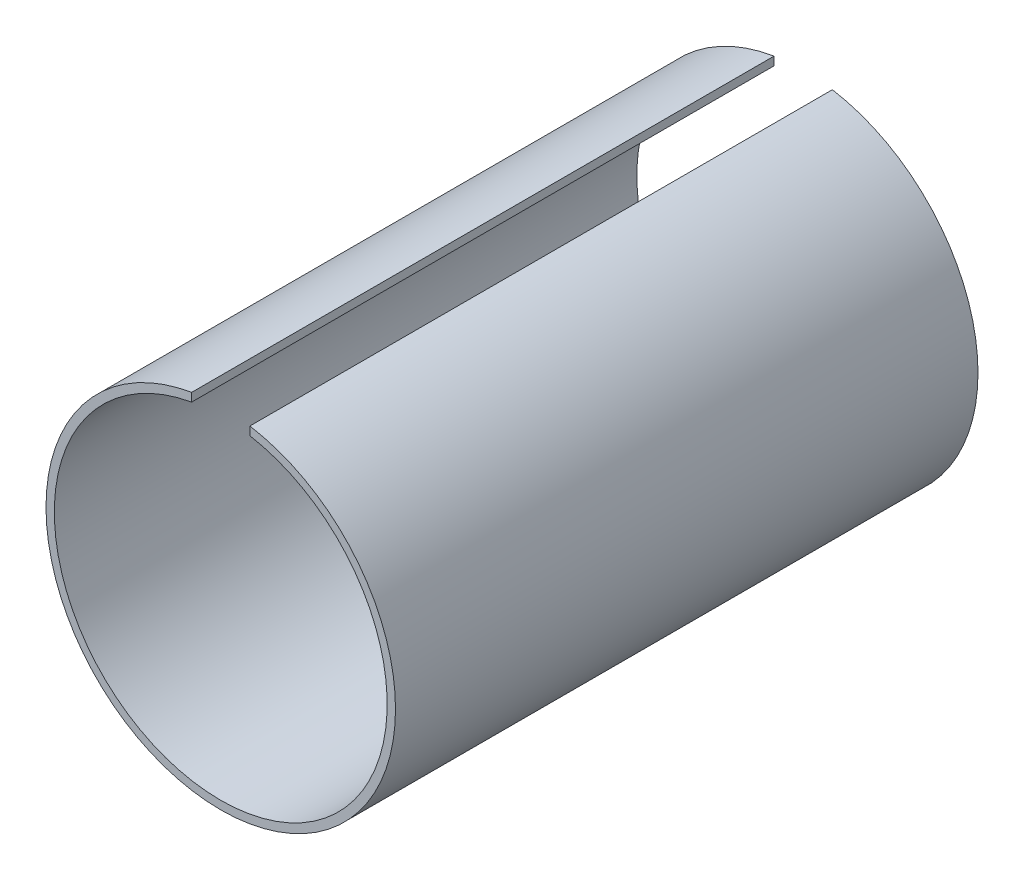
ISO-10303-21;
HEADER;
FILE_DESCRIPTION(('STEP AP214'),'2;1');
FILE_NAME('part.step','',(''),(''),'','','');
FILE_SCHEMA(('AUTOMOTIVE_DESIGN { 1 0 10303 214 1 1 1 1 }'));
ENDSEC;
DATA;
#1=APPLICATION_CONTEXT('core data for automotive mechanical design processes');
#2=APPLICATION_PROTOCOL_DEFINITION('international standard','automotive_design',2000,#1);
#3=PRODUCT_CONTEXT('',#1,'mechanical');
#4=PRODUCT('Part','Part','',(#3));
#5=PRODUCT_RELATED_PRODUCT_CATEGORY('part','',(#4));
#6=PRODUCT_DEFINITION_FORMATION('','',#4);
#7=PRODUCT_DEFINITION_CONTEXT('part definition',#1,'design');
#8=PRODUCT_DEFINITION('design','',#6,#7);
#9=PRODUCT_DEFINITION_SHAPE('','',#8);
#10=(LENGTH_UNIT() NAMED_UNIT(*) SI_UNIT(.MILLI.,.METRE.));
#11=(NAMED_UNIT(*) PLANE_ANGLE_UNIT() SI_UNIT($,.RADIAN.));
#12=(NAMED_UNIT(*) SI_UNIT($,.STERADIAN.) SOLID_ANGLE_UNIT());
#13=UNCERTAINTY_MEASURE_WITH_UNIT(LENGTH_MEASURE(1.E-05),#10,'distance_accuracy_value','');
#14=(GEOMETRIC_REPRESENTATION_CONTEXT(3) GLOBAL_UNCERTAINTY_ASSIGNED_CONTEXT((#13)) GLOBAL_UNIT_ASSIGNED_CONTEXT((#10,
#11,#12)) REPRESENTATION_CONTEXT('',''));
#15=CARTESIAN_POINT('',(0.,0.,0.));
#16=DIRECTION('',(0.,0.,1.));
#17=DIRECTION('',(1.,0.,0.));
#18=AXIS2_PLACEMENT_3D('',#15,#16,#17);
#19=CARTESIAN_POINT('',(0.,0.,35.));
#20=DIRECTION('',(0.,0.,1.));
#21=DIRECTION('',(1.,0.,0.));
#22=AXIS2_PLACEMENT_3D('',#19,#20,#21);
#23=PLANE('',#22);
#24=DIRECTION('',(0.,1.,0.));
#25=VECTOR('',#24,1.);
#26=CARTESIAN_POINT('',(3.5,0.,35.));
#27=LINE('',#26,#25);
#28=CARTESIAN_POINT('',(3.5,19.6913686675152,35.));
#29=VERTEX_POINT('',#28);
#30=CARTESIAN_POINT('',(3.5,20.7062792408487,35.));
#31=VERTEX_POINT('',#30);
#32=EDGE_CURVE('E108',#29,#31,#27,.T.);
#33=ORIENTED_EDGE('',*,*,#32,.F.);
#34=CARTESIAN_POINT('',(0.,0.,35.));
#35=DIRECTION('',(0.,0.,1.));
#36=DIRECTION('',(1.,0.,0.));
#37=AXIS2_PLACEMENT_3D('',#34,#35,#36);
#38=CIRCLE('',#37,20.);
#39=CARTESIAN_POINT('',(-3.5,19.6913686675152,35.));
#40=VERTEX_POINT('',#39);
#41=EDGE_CURVE('E117',#40,#29,#38,.T.);
#42=ORIENTED_EDGE('',*,*,#41,.F.);
#43=DIRECTION('',(0.,1.,0.));
#44=VECTOR('',#43,1.);
#45=CARTESIAN_POINT('',(-3.5,0.,35.));
#46=LINE('',#45,#44);
#47=CARTESIAN_POINT('',(-3.5,20.7062792408487,35.));
#48=VERTEX_POINT('',#47);
#49=EDGE_CURVE('E88',#40,#48,#46,.T.);
#50=ORIENTED_EDGE('',*,*,#49,.T.);
#51=CARTESIAN_POINT('',(0.,0.,35.));
#52=DIRECTION('',(0.,0.,1.));
#53=DIRECTION('',(1.,0.,0.));
#54=AXIS2_PLACEMENT_3D('',#51,#52,#53);
#55=CIRCLE('',#54,21.);
#56=EDGE_CURVE('E119',#48,#31,#55,.T.);
#57=ORIENTED_EDGE('',*,*,#56,.T.);
#58=EDGE_LOOP('',(#33,#42,#50,#57));
#59=FACE_BOUND('',#58,.T.);
#60=ADVANCED_FACE('F60',(#59),#23,.T.);
#61=CARTESIAN_POINT('',(0.,0.,-35.));
#62=DIRECTION('',(0.,0.,1.));
#63=DIRECTION('',(1.,0.,0.));
#64=AXIS2_PLACEMENT_3D('',#61,#62,#63);
#65=PLANE('',#64);
#66=CARTESIAN_POINT('',(0.,0.,-35.));
#67=DIRECTION('',(0.,0.,1.));
#68=DIRECTION('',(1.,0.,0.));
#69=AXIS2_PLACEMENT_3D('',#66,#67,#68);
#70=CIRCLE('',#69,20.);
#71=CARTESIAN_POINT('',(-3.5,19.6913686675152,-35.));
#72=VERTEX_POINT('',#71);
#73=CARTESIAN_POINT('',(3.5,19.6913686675152,-35.));
#74=VERTEX_POINT('',#73);
#75=EDGE_CURVE('E125',#72,#74,#70,.T.);
#76=ORIENTED_EDGE('',*,*,#75,.T.);
#77=DIRECTION('',(0.,1.,0.));
#78=VECTOR('',#77,1.);
#79=CARTESIAN_POINT('',(3.5,0.,-35.));
#80=LINE('',#79,#78);
#81=CARTESIAN_POINT('',(3.5,20.7062792408487,-35.));
#82=VERTEX_POINT('',#81);
#83=EDGE_CURVE('E78',#74,#82,#80,.T.);
#84=ORIENTED_EDGE('',*,*,#83,.T.);
#85=CARTESIAN_POINT('',(0.,0.,-35.));
#86=DIRECTION('',(0.,0.,1.));
#87=DIRECTION('',(1.,0.,0.));
#88=AXIS2_PLACEMENT_3D('',#85,#86,#87);
#89=CIRCLE('',#88,21.);
#90=CARTESIAN_POINT('',(-3.5,20.7062792408487,-35.));
#91=VERTEX_POINT('',#90);
#92=EDGE_CURVE('E124',#91,#82,#89,.T.);
#93=ORIENTED_EDGE('',*,*,#92,.F.);
#94=DIRECTION('',(0.,1.,0.));
#95=VECTOR('',#94,1.);
#96=CARTESIAN_POINT('',(-3.5,0.,-35.));
#97=LINE('',#96,#95);
#98=EDGE_CURVE('E142',#72,#91,#97,.T.);
#99=ORIENTED_EDGE('',*,*,#98,.F.);
#100=EDGE_LOOP('',(#76,#84,#93,#99));
#101=FACE_BOUND('',#100,.T.);
#102=ADVANCED_FACE('F154',(#101),#65,.F.);
#103=CARTESIAN_POINT('',(0.,0.,35.));
#104=DIRECTION('',(0.,0.,-1.));
#105=DIRECTION('',(-1.,0.,0.));
#106=AXIS2_PLACEMENT_3D('',#103,#104,#105);
#107=CYLINDRICAL_SURFACE('',#106,21.);
#108=ORIENTED_EDGE('',*,*,#92,.T.);
#109=DIRECTION('',(0.,0.,-1.));
#110=VECTOR('',#109,1.);
#111=CARTESIAN_POINT('',(3.5,20.7062792408487,35.));
#112=LINE('',#111,#110);
#113=EDGE_CURVE('E132',#82,#31,#112,.F.);
#114=ORIENTED_EDGE('',*,*,#113,.T.);
#115=ORIENTED_EDGE('',*,*,#56,.F.);
#116=DIRECTION('',(0.,0.,-1.));
#117=VECTOR('',#116,1.);
#118=CARTESIAN_POINT('',(-3.5,20.7062792408487,35.));
#119=LINE('',#118,#117);
#120=EDGE_CURVE('E140',#91,#48,#119,.F.);
#121=ORIENTED_EDGE('',*,*,#120,.F.);
#122=EDGE_LOOP('',(#108,#114,#115,#121));
#123=FACE_BOUND('',#122,.T.);
#124=ADVANCED_FACE('F62',(#123),#107,.T.);
#125=CARTESIAN_POINT('',(0.,0.,35.));
#126=DIRECTION('',(0.,0.,-1.));
#127=DIRECTION('',(-1.,0.,0.));
#128=AXIS2_PLACEMENT_3D('',#125,#126,#127);
#129=CYLINDRICAL_SURFACE('',#128,20.);
#130=DIRECTION('',(0.,0.,-1.));
#131=VECTOR('',#130,1.);
#132=CARTESIAN_POINT('',(3.5,19.6913686675152,35.));
#133=LINE('',#132,#131);
#134=EDGE_CURVE('E14',#74,#29,#133,.F.);
#135=ORIENTED_EDGE('',*,*,#134,.F.);
#136=ORIENTED_EDGE('',*,*,#75,.F.);
#137=DIRECTION('',(0.,0.,-1.));
#138=VECTOR('',#137,1.);
#139=CARTESIAN_POINT('',(-3.5,19.6913686675152,35.));
#140=LINE('',#139,#138);
#141=EDGE_CURVE('E69',#72,#40,#140,.F.);
#142=ORIENTED_EDGE('',*,*,#141,.T.);
#143=ORIENTED_EDGE('',*,*,#41,.T.);
#144=EDGE_LOOP('',(#135,#136,#142,#143));
#145=FACE_BOUND('',#144,.T.);
#146=ADVANCED_FACE('F122',(#145),#129,.F.);
#147=CARTESIAN_POINT('',(-3.5,0.,-35.));
#148=DIRECTION('',(1.,0.,0.));
#149=DIRECTION('',(0.,0.,-1.));
#150=AXIS2_PLACEMENT_3D('',#147,#148,#149);
#151=PLANE('',#150);
#152=ORIENTED_EDGE('',*,*,#120,.T.);
#153=ORIENTED_EDGE('',*,*,#49,.F.);
#154=ORIENTED_EDGE('',*,*,#141,.F.);
#155=ORIENTED_EDGE('',*,*,#98,.T.);
#156=EDGE_LOOP('',(#152,#153,#154,#155));
#157=FACE_BOUND('',#156,.T.);
#158=ADVANCED_FACE('F150',(#157),#151,.T.);
#159=CARTESIAN_POINT('',(3.5,0.,-35.));
#160=DIRECTION('',(1.,0.,0.));
#161=DIRECTION('',(0.,0.,-1.));
#162=AXIS2_PLACEMENT_3D('',#159,#160,#161);
#163=PLANE('',#162);
#164=ORIENTED_EDGE('',*,*,#83,.F.);
#165=ORIENTED_EDGE('',*,*,#134,.T.);
#166=ORIENTED_EDGE('',*,*,#32,.T.);
#167=ORIENTED_EDGE('',*,*,#113,.F.);
#168=EDGE_LOOP('',(#164,#165,#166,#167));
#169=FACE_BOUND('',#168,.T.);
#170=ADVANCED_FACE('F107',(#169),#163,.F.);
#171=CLOSED_SHELL('',(#60,#102,#124,#146,#158,#170));
#172=MANIFOLD_SOLID_BREP('B2',#171);
#173=ADVANCED_BREP_SHAPE_REPRESENTATION('',(#18,#172),#14);
#174=SHAPE_DEFINITION_REPRESENTATION(#9,#173);
ENDSEC;
END-ISO-10303-21;
